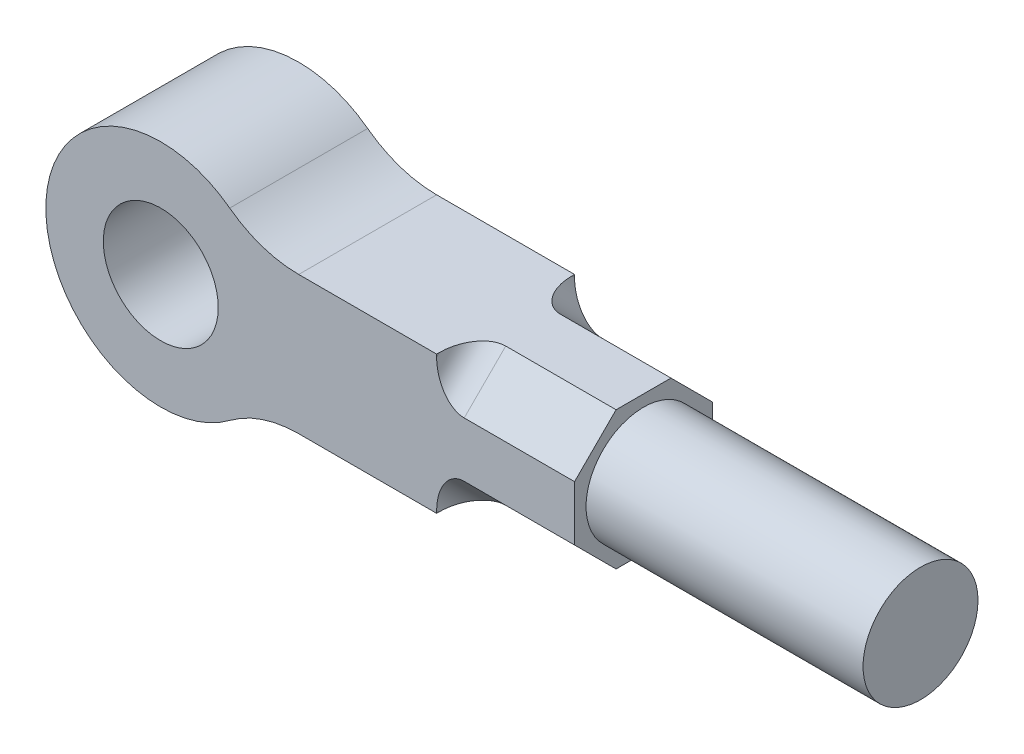
ISO-10303-21;
HEADER;
FILE_DESCRIPTION(('STEP AP214'),'2;1');
FILE_NAME('part.step','',(''),(''),'','','');
FILE_SCHEMA(('AUTOMOTIVE_DESIGN { 1 0 10303 214 1 1 1 1 }'));
ENDSEC;
DATA;
#1=APPLICATION_CONTEXT('core data for automotive mechanical design processes');
#2=APPLICATION_PROTOCOL_DEFINITION('international standard','automotive_design',2000,#1);
#3=PRODUCT_CONTEXT('',#1,'mechanical');
#4=PRODUCT('Part','Part','',(#3));
#5=PRODUCT_RELATED_PRODUCT_CATEGORY('part','',(#4));
#6=PRODUCT_DEFINITION_FORMATION('','',#4);
#7=PRODUCT_DEFINITION_CONTEXT('part definition',#1,'design');
#8=PRODUCT_DEFINITION('design','',#6,#7);
#9=PRODUCT_DEFINITION_SHAPE('','',#8);
#10=(LENGTH_UNIT() NAMED_UNIT(*) SI_UNIT(.MILLI.,.METRE.));
#11=(NAMED_UNIT(*) PLANE_ANGLE_UNIT() SI_UNIT($,.RADIAN.));
#12=(NAMED_UNIT(*) SI_UNIT($,.STERADIAN.) SOLID_ANGLE_UNIT());
#13=UNCERTAINTY_MEASURE_WITH_UNIT(LENGTH_MEASURE(1.E-05),#10,'distance_accuracy_value','');
#14=(GEOMETRIC_REPRESENTATION_CONTEXT(3) GLOBAL_UNCERTAINTY_ASSIGNED_CONTEXT((#13)) GLOBAL_UNIT_ASSIGNED_CONTEXT((#10,
#11,#12)) REPRESENTATION_CONTEXT('',''));
#15=CARTESIAN_POINT('',(0.,0.,0.));
#16=DIRECTION('',(0.,0.,1.));
#17=DIRECTION('',(1.,0.,0.));
#18=AXIS2_PLACEMENT_3D('',#15,#16,#17);
#19=CARTESIAN_POINT('',(60.,-80.,60.));
#20=DIRECTION('',(0.,0.,-1.));
#21=DIRECTION('',(-1.,0.,0.));
#22=AXIS2_PLACEMENT_3D('',#19,#20,#21);
#23=PLANE('',#22);
#24=DIRECTION('',(0.,-1.,0.));
#25=VECTOR('',#24,1.);
#26=CARTESIAN_POINT('',(120.,-11.9400000000001,59.9999999999992));
#27=LINE('',#26,#25);
#28=CARTESIAN_POINT('',(120.,-28.9105627484773,59.9999999999994));
#29=VERTEX_POINT('',#28);
#30=CARTESIAN_POINT('',(120.,-30.0000000000001,59.9999999999994));
#31=VERTEX_POINT('',#30);
#32=EDGE_CURVE('E241',#29,#31,#27,.T.);
#33=ORIENTED_EDGE('',*,*,#32,.F.);
#34=CARTESIAN_POINT('',(132.,-28.9105627484766,60.));
#35=DIRECTION('',(0.,0.,-1.));
#36=DIRECTION('',(0.,-1.,0.));
#37=AXIS2_PLACEMENT_3D('',#34,#35,#36);
#38=ELLIPSE('',#37,16.9705627484773,12.);
#39=CARTESIAN_POINT('',(132.,-11.9400000000001,59.9999999999992));
#40=VERTEX_POINT('',#39);
#41=EDGE_CURVE('E226',#29,#40,#38,.T.);
#42=ORIENTED_EDGE('',*,*,#41,.T.);
#43=DIRECTION('',(1.,0.,0.));
#44=VECTOR('',#43,1.);
#45=CARTESIAN_POINT('',(120.,-11.9400000000001,59.9999999999992));
#46=LINE('',#45,#44);
#47=CARTESIAN_POINT('',(180.,-11.9400000000001,59.9999999999992));
#48=VERTEX_POINT('',#47);
#49=EDGE_CURVE('E248',#40,#48,#46,.T.);
#50=ORIENTED_EDGE('',*,*,#49,.T.);
#51=DIRECTION('',(0.,1.,0.));
#52=VECTOR('',#51,1.);
#53=CARTESIAN_POINT('',(180.,30.,60.));
#54=LINE('',#53,#52);
#55=CARTESIAN_POINT('',(180.,11.9399999999994,60.));
#56=VERTEX_POINT('',#55);
#57=EDGE_CURVE('E285',#48,#56,#54,.T.);
#58=ORIENTED_EDGE('',*,*,#57,.T.);
#59=DIRECTION('',(1.,0.,0.));
#60=VECTOR('',#59,1.);
#61=CARTESIAN_POINT('',(120.,11.9399999999994,60.));
#62=LINE('',#61,#60);
#63=CARTESIAN_POINT('',(132.,11.9399999999994,60.));
#64=VERTEX_POINT('',#63);
#65=EDGE_CURVE('E266',#64,#56,#62,.T.);
#66=ORIENTED_EDGE('',*,*,#65,.F.);
#67=CARTESIAN_POINT('',(132.,28.9105627484763,60.));
#68=DIRECTION('',(0.,0.,-1.));
#69=DIRECTION('',(0.,1.,0.));
#70=AXIS2_PLACEMENT_3D('',#67,#68,#69);
#71=ELLIPSE('',#70,16.970562748477,12.);
#72=CARTESIAN_POINT('',(120.,28.9105627484763,60.));
#73=VERTEX_POINT('',#72);
#74=EDGE_CURVE('E11',#64,#73,#71,.T.);
#75=ORIENTED_EDGE('',*,*,#74,.T.);
#76=DIRECTION('',(0.,-1.,0.));
#77=VECTOR('',#76,1.);
#78=CARTESIAN_POINT('',(120.,0.,60.));
#79=LINE('',#78,#77);
#80=CARTESIAN_POINT('',(120.,30.,60.));
#81=VERTEX_POINT('',#80);
#82=EDGE_CURVE('E261',#81,#73,#79,.T.);
#83=ORIENTED_EDGE('',*,*,#82,.F.);
#84=DIRECTION('',(-1.,0.,0.));
#85=VECTOR('',#84,1.);
#86=CARTESIAN_POINT('',(60.,30.,60.));
#87=LINE('',#86,#85);
#88=CARTESIAN_POINT('',(60.,30.,60.));
#89=VERTEX_POINT('',#88);
#90=EDGE_CURVE('E287',#81,#89,#87,.T.);
#91=ORIENTED_EDGE('',*,*,#90,.T.);
#92=CARTESIAN_POINT('',(60.,80.,60.));
#93=DIRECTION('',(0.,0.,-1.));
#94=DIRECTION('',(-1.,0.,0.));
#95=AXIS2_PLACEMENT_3D('',#92,#93,#94);
#96=CIRCLE('',#95,50.);
#97=CARTESIAN_POINT('',(30.,40.,60.));
#98=VERTEX_POINT('',#97);
#99=EDGE_CURVE('E289',#89,#98,#96,.T.);
#100=ORIENTED_EDGE('',*,*,#99,.T.);
#101=CARTESIAN_POINT('',(0.,0.,60.));
#102=DIRECTION('',(0.,0.,1.));
#103=DIRECTION('',(1.,0.,0.));
#104=AXIS2_PLACEMENT_3D('',#101,#102,#103);
#105=CIRCLE('',#104,50.);
#106=CARTESIAN_POINT('',(30.,-40.,60.));
#107=VERTEX_POINT('',#106);
#108=EDGE_CURVE('E291',#98,#107,#105,.T.);
#109=ORIENTED_EDGE('',*,*,#108,.T.);
#110=CARTESIAN_POINT('',(60.,-80.,60.));
#111=DIRECTION('',(0.,0.,-1.));
#112=DIRECTION('',(-1.,0.,0.));
#113=AXIS2_PLACEMENT_3D('',#110,#111,#112);
#114=CIRCLE('',#113,50.);
#115=CARTESIAN_POINT('',(60.,-30.,60.));
#116=VERTEX_POINT('',#115);
#117=EDGE_CURVE('E279',#107,#116,#114,.T.);
#118=ORIENTED_EDGE('',*,*,#117,.T.);
#119=DIRECTION('',(1.,0.,0.));
#120=VECTOR('',#119,1.);
#121=CARTESIAN_POINT('',(60.,-30.,60.));
#122=LINE('',#121,#120);
#123=EDGE_CURVE('E282',#116,#31,#122,.T.);
#124=ORIENTED_EDGE('',*,*,#123,.T.);
#125=EDGE_LOOP('',(#33,#42,#50,#58,#66,#75,#83,#91,#100,#109,#118,#124));
#126=FACE_BOUND('',#125,.T.);
#127=CARTESIAN_POINT('',(0.,0.,60.));
#128=DIRECTION('',(0.,0.,1.));
#129=DIRECTION('',(1.,0.,0.));
#130=AXIS2_PLACEMENT_3D('',#127,#128,#129);
#131=CIRCLE('',#130,25.);
#132=CARTESIAN_POINT('',(25.,0.,60.));
#133=VERTEX_POINT('',#132);
#134=EDGE_CURVE('E273',#133,#133,#131,.T.);
#135=ORIENTED_EDGE('',*,*,#134,.F.);
#136=EDGE_LOOP('',(#135));
#137=FACE_BOUND('',#136,.T.);
#138=ADVANCED_FACE('F38',(#126,#137),#23,.F.);
#139=CARTESIAN_POINT('',(60.,-80.,0.));
#140=DIRECTION('',(0.,0.,-1.));
#141=DIRECTION('',(-1.,0.,0.));
#142=AXIS2_PLACEMENT_3D('',#139,#140,#141);
#143=PLANE('',#142);
#144=DIRECTION('',(0.,1.,0.));
#145=VECTOR('',#144,1.);
#146=CARTESIAN_POINT('',(120.,11.94,0.));
#147=LINE('',#146,#145);
#148=CARTESIAN_POINT('',(120.,28.9105627484771,0.));
#149=VERTEX_POINT('',#148);
#150=CARTESIAN_POINT('',(120.,30.,0.));
#151=VERTEX_POINT('',#150);
#152=EDGE_CURVE('E359',#149,#151,#147,.T.);
#153=ORIENTED_EDGE('',*,*,#152,.F.);
#154=CARTESIAN_POINT('',(132.,28.9105627484771,0.));
#155=DIRECTION('',(0.,0.,-1.));
#156=DIRECTION('',(0.,-1.,0.));
#157=AXIS2_PLACEMENT_3D('',#154,#155,#156);
#158=ELLIPSE('',#157,16.9705627484771,12.);
#159=CARTESIAN_POINT('',(132.,11.94,0.));
#160=VERTEX_POINT('',#159);
#161=EDGE_CURVE('E222',#149,#160,#158,.F.);
#162=ORIENTED_EDGE('',*,*,#161,.T.);
#163=DIRECTION('',(1.,0.,0.));
#164=VECTOR('',#163,1.);
#165=CARTESIAN_POINT('',(120.,11.94,0.));
#166=LINE('',#165,#164);
#167=CARTESIAN_POINT('',(180.,11.94,0.));
#168=VERTEX_POINT('',#167);
#169=EDGE_CURVE('E259',#160,#168,#166,.T.);
#170=ORIENTED_EDGE('',*,*,#169,.T.);
#171=DIRECTION('',(0.,1.,0.));
#172=VECTOR('',#171,1.);
#173=CARTESIAN_POINT('',(180.,30.,0.));
#174=LINE('',#173,#172);
#175=CARTESIAN_POINT('',(180.,-11.9400000000004,0.));
#176=VERTEX_POINT('',#175);
#177=EDGE_CURVE('E299',#176,#168,#174,.T.);
#178=ORIENTED_EDGE('',*,*,#177,.F.);
#179=DIRECTION('',(1.,0.,0.));
#180=VECTOR('',#179,1.);
#181=CARTESIAN_POINT('',(120.,-11.9400000000004,0.));
#182=LINE('',#181,#180);
#183=CARTESIAN_POINT('',(132.,-11.9400000000004,0.));
#184=VERTEX_POINT('',#183);
#185=EDGE_CURVE('E171',#184,#176,#182,.T.);
#186=ORIENTED_EDGE('',*,*,#185,.F.);
#187=CARTESIAN_POINT('',(132.,-28.9105627484775,0.));
#188=DIRECTION('',(0.,0.,-1.));
#189=DIRECTION('',(0.,-1.,0.));
#190=AXIS2_PLACEMENT_3D('',#187,#188,#189);
#191=ELLIPSE('',#190,16.9705627484771,12.);
#192=CARTESIAN_POINT('',(120.,-28.9105627484775,0.));
#193=VERTEX_POINT('',#192);
#194=EDGE_CURVE('E220',#184,#193,#191,.F.);
#195=ORIENTED_EDGE('',*,*,#194,.T.);
#196=DIRECTION('',(0.,1.,0.));
#197=VECTOR('',#196,1.);
#198=CARTESIAN_POINT('',(120.,0.,0.));
#199=LINE('',#198,#197);
#200=CARTESIAN_POINT('',(120.,-30.,0.));
#201=VERTEX_POINT('',#200);
#202=EDGE_CURVE('E182',#201,#193,#199,.T.);
#203=ORIENTED_EDGE('',*,*,#202,.F.);
#204=DIRECTION('',(1.,0.,0.));
#205=VECTOR('',#204,1.);
#206=CARTESIAN_POINT('',(60.,-30.,0.));
#207=LINE('',#206,#205);
#208=CARTESIAN_POINT('',(60.,-30.,0.));
#209=VERTEX_POINT('',#208);
#210=EDGE_CURVE('E296',#209,#201,#207,.T.);
#211=ORIENTED_EDGE('',*,*,#210,.F.);
#212=CARTESIAN_POINT('',(60.,-80.,0.));
#213=DIRECTION('',(0.,0.,-1.));
#214=DIRECTION('',(-1.,0.,0.));
#215=AXIS2_PLACEMENT_3D('',#212,#213,#214);
#216=CIRCLE('',#215,50.);
#217=CARTESIAN_POINT('',(30.,-40.,0.));
#218=VERTEX_POINT('',#217);
#219=EDGE_CURVE('E276',#218,#209,#216,.T.);
#220=ORIENTED_EDGE('',*,*,#219,.F.);
#221=CARTESIAN_POINT('',(0.,0.,0.));
#222=DIRECTION('',(0.,0.,1.));
#223=DIRECTION('',(1.,0.,0.));
#224=AXIS2_PLACEMENT_3D('',#221,#222,#223);
#225=CIRCLE('',#224,50.);
#226=CARTESIAN_POINT('',(30.,40.,0.));
#227=VERTEX_POINT('',#226);
#228=EDGE_CURVE('E283',#227,#218,#225,.T.);
#229=ORIENTED_EDGE('',*,*,#228,.F.);
#230=CARTESIAN_POINT('',(60.,80.,0.));
#231=DIRECTION('',(0.,0.,-1.));
#232=DIRECTION('',(-1.,0.,0.));
#233=AXIS2_PLACEMENT_3D('',#230,#231,#232);
#234=CIRCLE('',#233,50.);
#235=CARTESIAN_POINT('',(60.,30.,0.));
#236=VERTEX_POINT('',#235);
#237=EDGE_CURVE('E303',#236,#227,#234,.T.);
#238=ORIENTED_EDGE('',*,*,#237,.F.);
#239=DIRECTION('',(-1.,0.,0.));
#240=VECTOR('',#239,1.);
#241=CARTESIAN_POINT('',(60.,30.,0.));
#242=LINE('',#241,#240);
#243=EDGE_CURVE('E301',#151,#236,#242,.T.);
#244=ORIENTED_EDGE('',*,*,#243,.F.);
#245=EDGE_LOOP('',(#153,#162,#170,#178,#186,#195,#203,#211,#220,#229,#238,#244));
#246=FACE_BOUND('',#245,.T.);
#247=CARTESIAN_POINT('',(0.,0.,0.));
#248=DIRECTION('',(0.,0.,1.));
#249=DIRECTION('',(1.,0.,0.));
#250=AXIS2_PLACEMENT_3D('',#247,#248,#249);
#251=CIRCLE('',#250,25.);
#252=CARTESIAN_POINT('',(25.,0.,0.));
#253=VERTEX_POINT('',#252);
#254=EDGE_CURVE('E271',#253,#253,#251,.T.);
#255=ORIENTED_EDGE('',*,*,#254,.T.);
#256=EDGE_LOOP('',(#255));
#257=FACE_BOUND('',#256,.T.);
#258=ADVANCED_FACE('F322',(#246,#257),#143,.T.);
#259=CARTESIAN_POINT('',(60.,-80.,60.));
#260=DIRECTION('',(0.,0.,-1.));
#261=DIRECTION('',(-1.,0.,0.));
#262=AXIS2_PLACEMENT_3D('',#259,#260,#261);
#263=CYLINDRICAL_SURFACE('',#262,50.);
#264=ORIENTED_EDGE('',*,*,#219,.T.);
#265=DIRECTION('',(0.,0.,-1.));
#266=VECTOR('',#265,1.);
#267=CARTESIAN_POINT('',(60.,-30.,60.));
#268=LINE('',#267,#266);
#269=EDGE_CURVE('E189',#116,#209,#268,.T.);
#270=ORIENTED_EDGE('',*,*,#269,.F.);
#271=ORIENTED_EDGE('',*,*,#117,.F.);
#272=DIRECTION('',(0.,0.,-1.));
#273=VECTOR('',#272,1.);
#274=CARTESIAN_POINT('',(30.,-40.,60.));
#275=LINE('',#274,#273);
#276=EDGE_CURVE('E293',#107,#218,#275,.T.);
#277=ORIENTED_EDGE('',*,*,#276,.T.);
#278=EDGE_LOOP('',(#264,#270,#271,#277));
#279=FACE_BOUND('',#278,.T.);
#280=ADVANCED_FACE('F331',(#279),#263,.F.);
#281=CARTESIAN_POINT('',(60.,-30.,60.));
#282=DIRECTION('',(0.,1.,0.));
#283=DIRECTION('',(0.,0.,1.));
#284=AXIS2_PLACEMENT_3D('',#281,#282,#283);
#285=PLANE('',#284);
#286=DIRECTION('',(0.,0.,-1.));
#287=VECTOR('',#286,1.);
#288=CARTESIAN_POINT('',(180.,-30.,60.));
#289=LINE('',#288,#287);
#290=CARTESIAN_POINT('',(180.,-30.,41.9399999999996));
#291=VERTEX_POINT('',#290);
#292=CARTESIAN_POINT('',(180.,-30.,18.0599999999997));
#293=VERTEX_POINT('',#292);
#294=EDGE_CURVE('E166',#291,#293,#289,.T.);
#295=ORIENTED_EDGE('',*,*,#294,.F.);
#296=DIRECTION('',(1.,0.,0.));
#297=VECTOR('',#296,1.);
#298=CARTESIAN_POINT('',(120.,-30.0000000000003,41.9399999999994));
#299=LINE('',#298,#297);
#300=CARTESIAN_POINT('',(132.,-30.0000000000003,41.9399999999994));
#301=VERTEX_POINT('',#300);
#302=EDGE_CURVE('E234',#301,#291,#299,.T.);
#303=ORIENTED_EDGE('',*,*,#302,.F.);
#304=CARTESIAN_POINT('',(132.,-30.,58.9105627484766));
#305=DIRECTION('',(0.,1.,0.));
#306=DIRECTION('',(0.,0.,-1.));
#307=AXIS2_PLACEMENT_3D('',#304,#305,#306);
#308=ELLIPSE('',#307,16.970562748477,12.);
#309=CARTESIAN_POINT('',(120.,-30.0000000000001,58.9105627484765));
#310=VERTEX_POINT('',#309);
#311=EDGE_CURVE('E228',#301,#310,#308,.T.);
#312=ORIENTED_EDGE('',*,*,#311,.T.);
#313=DIRECTION('',(0.,0.,-1.));
#314=VECTOR('',#313,1.);
#315=CARTESIAN_POINT('',(120.,-30.0000000000001,59.9999999999994));
#316=LINE('',#315,#314);
#317=EDGE_CURVE('E232',#31,#310,#316,.T.);
#318=ORIENTED_EDGE('',*,*,#317,.F.);
#319=ORIENTED_EDGE('',*,*,#123,.F.);
#320=ORIENTED_EDGE('',*,*,#269,.T.);
#321=ORIENTED_EDGE('',*,*,#210,.T.);
#322=DIRECTION('',(0.,0.,-1.));
#323=VECTOR('',#322,1.);
#324=CARTESIAN_POINT('',(120.,-30.,0.));
#325=LINE('',#324,#323);
#326=CARTESIAN_POINT('',(120.,-30.,1.08943725152253));
#327=VERTEX_POINT('',#326);
#328=EDGE_CURVE('E367',#327,#201,#325,.T.);
#329=ORIENTED_EDGE('',*,*,#328,.F.);
#330=CARTESIAN_POINT('',(132.,-30.,1.08943725152253));
#331=DIRECTION('',(0.,1.,0.));
#332=DIRECTION('',(0.,0.,1.));
#333=AXIS2_PLACEMENT_3D('',#330,#331,#332);
#334=ELLIPSE('',#333,16.9705627484772,12.);
#335=CARTESIAN_POINT('',(132.,-30.,18.0599999999997));
#336=VERTEX_POINT('',#335);
#337=EDGE_CURVE('E168',#327,#336,#334,.T.);
#338=ORIENTED_EDGE('',*,*,#337,.T.);
#339=DIRECTION('',(1.,0.,0.));
#340=VECTOR('',#339,1.);
#341=CARTESIAN_POINT('',(120.,-30.,18.0599999999997));
#342=LINE('',#341,#340);
#343=EDGE_CURVE('E161',#336,#293,#342,.T.);
#344=ORIENTED_EDGE('',*,*,#343,.T.);
#345=EDGE_LOOP('',(#295,#303,#312,#318,#319,#320,#321,#329,#338,#344));
#346=FACE_BOUND('',#345,.T.);
#347=ADVANCED_FACE('F163',(#346),#285,.F.);
#348=CARTESIAN_POINT('',(180.,30.,60.));
#349=DIRECTION('',(-1.,0.,0.));
#350=DIRECTION('',(0.,0.,1.));
#351=AXIS2_PLACEMENT_3D('',#348,#349,#350);
#352=PLANE('',#351);
#353=CARTESIAN_POINT('',(180.,0.,30.));
#354=DIRECTION('',(1.,0.,0.));
#355=DIRECTION('',(0.,0.,-1.));
#356=AXIS2_PLACEMENT_3D('',#353,#354,#355);
#357=CIRCLE('',#356,25.);
#358=CARTESIAN_POINT('',(180.,0.,5.));
#359=VERTEX_POINT('',#358);
#360=EDGE_CURVE('E193',#359,#359,#357,.T.);
#361=ORIENTED_EDGE('',*,*,#360,.F.);
#362=EDGE_LOOP('',(#361));
#363=FACE_BOUND('',#362,.T.);
#364=ORIENTED_EDGE('',*,*,#57,.F.);
#365=DIRECTION('',(0.,0.707106781186552,0.707106781186543));
#366=VECTOR('',#365,1.);
#367=CARTESIAN_POINT('',(180.,-30.0000000000003,41.9399999999994));
#368=LINE('',#367,#366);
#369=EDGE_CURVE('E188',#291,#48,#368,.T.);
#370=ORIENTED_EDGE('',*,*,#369,.F.);
#371=ORIENTED_EDGE('',*,*,#294,.T.);
#372=DIRECTION('',(0.,-0.707106781186545,0.70710678118655));
#373=VECTOR('',#372,1.);
#374=CARTESIAN_POINT('',(180.,-5.97000000000024,-5.9700000000002));
#375=LINE('',#374,#373);
#376=EDGE_CURVE('E175',#176,#293,#375,.T.);
#377=ORIENTED_EDGE('',*,*,#376,.F.);
#378=ORIENTED_EDGE('',*,*,#177,.T.);
#379=DIRECTION('',(0.,-0.707106781186547,-0.707106781186547));
#380=VECTOR('',#379,1.);
#381=CARTESIAN_POINT('',(180.,30.,18.06));
#382=LINE('',#381,#380);
#383=CARTESIAN_POINT('',(180.,30.,18.06));
#384=VERTEX_POINT('',#383);
#385=EDGE_CURVE('E172',#384,#168,#382,.T.);
#386=ORIENTED_EDGE('',*,*,#385,.F.);
#387=DIRECTION('',(0.,0.,-1.));
#388=VECTOR('',#387,1.);
#389=CARTESIAN_POINT('',(180.,30.,60.));
#390=LINE('',#389,#388);
#391=CARTESIAN_POINT('',(180.,30.,41.939999999999));
#392=VERTEX_POINT('',#391);
#393=EDGE_CURVE('E190',#392,#384,#390,.T.);
#394=ORIENTED_EDGE('',*,*,#393,.F.);
#395=DIRECTION('',(0.,0.70710678118654,-0.707106781186555));
#396=VECTOR('',#395,1.);
#397=CARTESIAN_POINT('',(180.,35.9699999999998,35.969999999999));
#398=LINE('',#397,#396);
#399=EDGE_CURVE('E181',#56,#392,#398,.T.);
#400=ORIENTED_EDGE('',*,*,#399,.F.);
#401=EDGE_LOOP('',(#364,#370,#371,#377,#378,#386,#394,#400));
#402=FACE_BOUND('',#401,.T.);
#403=ADVANCED_FACE('F186',(#363,#402),#352,.F.);
#404=CARTESIAN_POINT('',(60.,30.,60.));
#405=DIRECTION('',(0.,-1.,0.));
#406=DIRECTION('',(1.,0.,0.));
#407=AXIS2_PLACEMENT_3D('',#404,#405,#406);
#408=PLANE('',#407);
#409=ORIENTED_EDGE('',*,*,#393,.T.);
#410=DIRECTION('',(1.,0.,0.));
#411=VECTOR('',#410,1.);
#412=CARTESIAN_POINT('',(120.,30.,18.06));
#413=LINE('',#412,#411);
#414=CARTESIAN_POINT('',(132.,30.,18.06));
#415=VERTEX_POINT('',#414);
#416=EDGE_CURVE('E346',#415,#384,#413,.T.);
#417=ORIENTED_EDGE('',*,*,#416,.F.);
#418=CARTESIAN_POINT('',(132.,30.,1.08943725152286));
#419=DIRECTION('',(0.,-1.,0.));
#420=DIRECTION('',(0.,0.,-1.));
#421=AXIS2_PLACEMENT_3D('',#418,#419,#420);
#422=ELLIPSE('',#421,16.9705627484771,12.);
#423=CARTESIAN_POINT('',(120.,30.,1.08943725152286));
#424=VERTEX_POINT('',#423);
#425=EDGE_CURVE('E224',#415,#424,#422,.T.);
#426=ORIENTED_EDGE('',*,*,#425,.T.);
#427=DIRECTION('',(0.,0.,1.));
#428=VECTOR('',#427,1.);
#429=CARTESIAN_POINT('',(120.,30.,0.));
#430=LINE('',#429,#428);
#431=EDGE_CURVE('E351',#151,#424,#430,.T.);
#432=ORIENTED_EDGE('',*,*,#431,.F.);
#433=ORIENTED_EDGE('',*,*,#243,.T.);
#434=DIRECTION('',(0.,0.,-1.));
#435=VECTOR('',#434,1.);
#436=CARTESIAN_POINT('',(60.,30.,60.));
#437=LINE('',#436,#435);
#438=EDGE_CURVE('E196',#89,#236,#437,.T.);
#439=ORIENTED_EDGE('',*,*,#438,.F.);
#440=ORIENTED_EDGE('',*,*,#90,.F.);
#441=DIRECTION('',(0.,0.,1.));
#442=VECTOR('',#441,1.);
#443=CARTESIAN_POINT('',(120.,30.,0.));
#444=LINE('',#443,#442);
#445=CARTESIAN_POINT('',(120.,30.,58.9105627484763));
#446=VERTEX_POINT('',#445);
#447=EDGE_CURVE('E264',#446,#81,#444,.T.);
#448=ORIENTED_EDGE('',*,*,#447,.F.);
#449=CARTESIAN_POINT('',(132.,30.,58.9105627484763));
#450=DIRECTION('',(0.,-1.,0.));
#451=DIRECTION('',(0.,0.,-1.));
#452=AXIS2_PLACEMENT_3D('',#449,#450,#451);
#453=ELLIPSE('',#452,16.9705627484773,12.);
#454=CARTESIAN_POINT('',(132.,30.,41.939999999999));
#455=VERTEX_POINT('',#454);
#456=EDGE_CURVE('E46',#446,#455,#453,.T.);
#457=ORIENTED_EDGE('',*,*,#456,.T.);
#458=DIRECTION('',(1.,0.,0.));
#459=VECTOR('',#458,1.);
#460=CARTESIAN_POINT('',(120.,30.,41.939999999999));
#461=LINE('',#460,#459);
#462=EDGE_CURVE('E269',#455,#392,#461,.T.);
#463=ORIENTED_EDGE('',*,*,#462,.T.);
#464=EDGE_LOOP('',(#409,#417,#426,#432,#433,#439,#440,#448,#457,#463));
#465=FACE_BOUND('',#464,.T.);
#466=ADVANCED_FACE('F334',(#465),#408,.F.);
#467=CARTESIAN_POINT('',(60.,80.,60.));
#468=DIRECTION('',(0.,0.,-1.));
#469=DIRECTION('',(-1.,0.,0.));
#470=AXIS2_PLACEMENT_3D('',#467,#468,#469);
#471=CYLINDRICAL_SURFACE('',#470,50.);
#472=ORIENTED_EDGE('',*,*,#237,.T.);
#473=DIRECTION('',(0.,0.,-1.));
#474=VECTOR('',#473,1.);
#475=CARTESIAN_POINT('',(30.,40.,60.));
#476=LINE('',#475,#474);
#477=EDGE_CURVE('E308',#98,#227,#476,.T.);
#478=ORIENTED_EDGE('',*,*,#477,.F.);
#479=ORIENTED_EDGE('',*,*,#99,.F.);
#480=ORIENTED_EDGE('',*,*,#438,.T.);
#481=EDGE_LOOP('',(#472,#478,#479,#480));
#482=FACE_BOUND('',#481,.T.);
#483=ADVANCED_FACE('F315',(#482),#471,.F.);
#484=CARTESIAN_POINT('',(0.,0.,60.));
#485=DIRECTION('',(0.,0.,-1.));
#486=DIRECTION('',(-1.,0.,0.));
#487=AXIS2_PLACEMENT_3D('',#484,#485,#486);
#488=CYLINDRICAL_SURFACE('',#487,50.);
#489=ORIENTED_EDGE('',*,*,#228,.T.);
#490=ORIENTED_EDGE('',*,*,#276,.F.);
#491=ORIENTED_EDGE('',*,*,#108,.F.);
#492=ORIENTED_EDGE('',*,*,#477,.T.);
#493=EDGE_LOOP('',(#489,#490,#491,#492));
#494=FACE_BOUND('',#493,.T.);
#495=ADVANCED_FACE('F327',(#494),#488,.T.);
#496=CARTESIAN_POINT('',(0.,0.,60.));
#497=DIRECTION('',(0.,0.,-1.));
#498=DIRECTION('',(-1.,0.,0.));
#499=AXIS2_PLACEMENT_3D('',#496,#497,#498);
#500=CYLINDRICAL_SURFACE('',#499,25.);
#501=ORIENTED_EDGE('',*,*,#134,.T.);
#502=EDGE_LOOP('',(#501));
#503=FACE_BOUND('',#502,.T.);
#504=ORIENTED_EDGE('',*,*,#254,.F.);
#505=EDGE_LOOP('',(#504));
#506=FACE_BOUND('',#505,.T.);
#507=ADVANCED_FACE('F390',(#503,#506),#500,.F.);
#508=CARTESIAN_POINT('',(120.,35.9699999999998,35.969999999999));
#509=DIRECTION('',(0.,-0.707106781186555,-0.70710678118654));
#510=DIRECTION('',(0.,0.70710678118654,-0.707106781186555));
#511=AXIS2_PLACEMENT_3D('',#508,#509,#510);
#512=PLANE('',#511);
#513=ORIENTED_EDGE('',*,*,#462,.F.);
#514=DIRECTION('',(0.,0.70710678118654,-0.707106781186555));
#515=VECTOR('',#514,1.);
#516=CARTESIAN_POINT('',(132.,35.9699999999998,35.969999999999));
#517=LINE('',#516,#515);
#518=EDGE_CURVE('E53',#455,#64,#517,.F.);
#519=ORIENTED_EDGE('',*,*,#518,.T.);
#520=ORIENTED_EDGE('',*,*,#65,.T.);
#521=ORIENTED_EDGE('',*,*,#399,.T.);
#522=EDGE_LOOP('',(#513,#519,#520,#521));
#523=FACE_BOUND('',#522,.T.);
#524=ADVANCED_FACE('F341',(#523),#512,.F.);
#525=CARTESIAN_POINT('',(120.,0.,0.));
#526=DIRECTION('',(1.,0.,0.));
#527=DIRECTION('',(0.,0.,-1.));
#528=AXIS2_PLACEMENT_3D('',#525,#526,#527);
#529=PLANE('',#528);
#530=ORIENTED_EDGE('',*,*,#82,.T.);
#531=DIRECTION('',(0.,0.70710678118654,-0.707106781186555));
#532=VECTOR('',#531,1.);
#533=CARTESIAN_POINT('',(120.,44.4552813742385,44.4552813742375));
#534=LINE('',#533,#532);
#535=EDGE_CURVE('E215',#73,#446,#534,.T.);
#536=ORIENTED_EDGE('',*,*,#535,.T.);
#537=ORIENTED_EDGE('',*,*,#447,.T.);
#538=EDGE_LOOP('',(#530,#536,#537));
#539=FACE_BOUND('',#538,.T.);
#540=ADVANCED_FACE('F336',(#539),#529,.T.);
#541=CARTESIAN_POINT('',(120.,30.,18.06));
#542=DIRECTION('',(0.,-0.707106781186547,0.707106781186547));
#543=DIRECTION('',(0.,-0.707106781186548,-0.707106781186548));
#544=AXIS2_PLACEMENT_3D('',#541,#542,#543);
#545=PLANE('',#544);
#546=ORIENTED_EDGE('',*,*,#169,.F.);
#547=DIRECTION('',(0.,-0.707106781186548,-0.707106781186548));
#548=VECTOR('',#547,1.);
#549=CARTESIAN_POINT('',(132.,30.,18.06));
#550=LINE('',#549,#548);
#551=EDGE_CURVE('E208',#160,#415,#550,.F.);
#552=ORIENTED_EDGE('',*,*,#551,.T.);
#553=ORIENTED_EDGE('',*,*,#416,.T.);
#554=ORIENTED_EDGE('',*,*,#385,.T.);
#555=EDGE_LOOP('',(#546,#552,#553,#554));
#556=FACE_BOUND('',#555,.T.);
#557=ADVANCED_FACE('F422',(#556),#545,.F.);
#558=CARTESIAN_POINT('',(120.,0.,0.));
#559=DIRECTION('',(1.,0.,0.));
#560=DIRECTION('',(0.,0.,-1.));
#561=AXIS2_PLACEMENT_3D('',#558,#559,#560);
#562=PLANE('',#561);
#563=ORIENTED_EDGE('',*,*,#431,.T.);
#564=DIRECTION('',(0.,-0.707106781186548,-0.707106781186548));
#565=VECTOR('',#564,1.);
#566=CARTESIAN_POINT('',(120.,14.4552813742386,-14.4552813742386));
#567=LINE('',#566,#565);
#568=EDGE_CURVE('E205',#424,#149,#567,.T.);
#569=ORIENTED_EDGE('',*,*,#568,.T.);
#570=ORIENTED_EDGE('',*,*,#152,.T.);
#571=EDGE_LOOP('',(#563,#569,#570));
#572=FACE_BOUND('',#571,.T.);
#573=ADVANCED_FACE('F358',(#572),#562,.T.);
#574=CARTESIAN_POINT('',(120.,-5.97000000000024,-5.9700000000002));
#575=DIRECTION('',(0.,0.70710678118655,0.707106781186545));
#576=DIRECTION('',(0.,-0.707106781186545,0.70710678118655));
#577=AXIS2_PLACEMENT_3D('',#574,#575,#576);
#578=PLANE('',#577);
#579=ORIENTED_EDGE('',*,*,#343,.F.);
#580=DIRECTION('',(0.,-0.707106781186545,0.70710678118655));
#581=VECTOR('',#580,1.);
#582=CARTESIAN_POINT('',(132.,-5.97000000000024,-5.9700000000002));
#583=LINE('',#582,#581);
#584=EDGE_CURVE('E203',#336,#184,#583,.F.);
#585=ORIENTED_EDGE('',*,*,#584,.T.);
#586=ORIENTED_EDGE('',*,*,#185,.T.);
#587=ORIENTED_EDGE('',*,*,#376,.T.);
#588=EDGE_LOOP('',(#579,#585,#586,#587));
#589=FACE_BOUND('',#588,.T.);
#590=ADVANCED_FACE('F176',(#589),#578,.F.);
#591=CARTESIAN_POINT('',(120.,0.,0.));
#592=DIRECTION('',(1.,0.,0.));
#593=DIRECTION('',(0.,0.,-1.));
#594=AXIS2_PLACEMENT_3D('',#591,#592,#593);
#595=PLANE('',#594);
#596=ORIENTED_EDGE('',*,*,#202,.T.);
#597=DIRECTION('',(0.,-0.707106781186545,0.70710678118655));
#598=VECTOR('',#597,1.);
#599=CARTESIAN_POINT('',(120.,-14.4552813742388,-14.4552813742387));
#600=LINE('',#599,#598);
#601=EDGE_CURVE('E200',#193,#327,#600,.T.);
#602=ORIENTED_EDGE('',*,*,#601,.T.);
#603=ORIENTED_EDGE('',*,*,#328,.T.);
#604=EDGE_LOOP('',(#596,#602,#603));
#605=FACE_BOUND('',#604,.T.);
#606=ADVANCED_FACE('F441',(#605),#595,.T.);
#607=CARTESIAN_POINT('',(120.,-30.0000000000003,41.9399999999994));
#608=DIRECTION('',(0.,0.707106781186543,-0.707106781186552));
#609=DIRECTION('',(0.,0.707106781186552,0.707106781186543));
#610=AXIS2_PLACEMENT_3D('',#607,#608,#609);
#611=PLANE('',#610);
#612=ORIENTED_EDGE('',*,*,#49,.F.);
#613=DIRECTION('',(0.,0.707106781186552,0.707106781186543));
#614=VECTOR('',#613,1.);
#615=CARTESIAN_POINT('',(132.,-30.0000000000003,41.9399999999994));
#616=LINE('',#615,#614);
#617=EDGE_CURVE('E213',#40,#301,#616,.F.);
#618=ORIENTED_EDGE('',*,*,#617,.T.);
#619=ORIENTED_EDGE('',*,*,#302,.T.);
#620=ORIENTED_EDGE('',*,*,#369,.T.);
#621=EDGE_LOOP('',(#612,#618,#619,#620));
#622=FACE_BOUND('',#621,.T.);
#623=ADVANCED_FACE('F250',(#622),#611,.F.);
#624=CARTESIAN_POINT('',(120.,0.,0.));
#625=DIRECTION('',(-1.,0.,0.));
#626=DIRECTION('',(0.,0.,1.));
#627=AXIS2_PLACEMENT_3D('',#624,#625,#626);
#628=PLANE('',#627);
#629=ORIENTED_EDGE('',*,*,#317,.T.);
#630=DIRECTION('',(0.,0.707106781186552,0.707106781186543));
#631=VECTOR('',#630,1.);
#632=CARTESIAN_POINT('',(120.,-20.4252813742386,68.4852813742379));
#633=LINE('',#632,#631);
#634=EDGE_CURVE('E210',#310,#29,#633,.T.);
#635=ORIENTED_EDGE('',*,*,#634,.T.);
#636=ORIENTED_EDGE('',*,*,#32,.T.);
#637=EDGE_LOOP('',(#629,#635,#636));
#638=FACE_BOUND('',#637,.T.);
#639=ADVANCED_FACE('F239',(#638),#628,.F.);
#640=CARTESIAN_POINT('',(300.5,0.,30.));
#641=DIRECTION('',(-1.,0.,0.));
#642=DIRECTION('',(0.,0.,1.));
#643=AXIS2_PLACEMENT_3D('',#640,#641,#642);
#644=CYLINDRICAL_SURFACE('',#643,25.);
#645=CARTESIAN_POINT('',(300.5,0.,30.));
#646=DIRECTION('',(1.,0.,0.));
#647=DIRECTION('',(0.,0.,-1.));
#648=AXIS2_PLACEMENT_3D('',#645,#646,#647);
#649=CIRCLE('',#648,25.);
#650=CARTESIAN_POINT('',(300.5,0.,5.));
#651=VERTEX_POINT('',#650);
#652=EDGE_CURVE('E251',#651,#651,#649,.T.);
#653=ORIENTED_EDGE('',*,*,#652,.F.);
#654=EDGE_LOOP('',(#653));
#655=FACE_BOUND('',#654,.T.);
#656=ORIENTED_EDGE('',*,*,#360,.T.);
#657=EDGE_LOOP('',(#656));
#658=FACE_BOUND('',#657,.T.);
#659=ADVANCED_FACE('F373',(#655,#658),#644,.T.);
#660=CARTESIAN_POINT('',(300.5,0.,0.));
#661=DIRECTION('',(1.,0.,0.));
#662=DIRECTION('',(0.,0.,-1.));
#663=AXIS2_PLACEMENT_3D('',#660,#661,#662);
#664=PLANE('',#663);
#665=ORIENTED_EDGE('',*,*,#652,.T.);
#666=EDGE_LOOP('',(#665));
#667=FACE_BOUND('',#666,.T.);
#668=ADVANCED_FACE('F468',(#667),#664,.T.);
#669=CARTESIAN_POINT('',(132.,-14.4552813742388,-14.4552813742387));
#670=DIRECTION('',(0.,-0.707106781186545,0.70710678118655));
#671=DIRECTION('',(0.,-0.70710678118655,-0.707106781186545));
#672=AXIS2_PLACEMENT_3D('',#669,#670,#671);
#673=CYLINDRICAL_SURFACE('',#672,12.);
#674=ORIENTED_EDGE('',*,*,#194,.F.);
#675=ORIENTED_EDGE('',*,*,#584,.F.);
#676=ORIENTED_EDGE('',*,*,#337,.F.);
#677=ORIENTED_EDGE('',*,*,#601,.F.);
#678=EDGE_LOOP('',(#674,#675,#676,#677));
#679=FACE_BOUND('',#678,.T.);
#680=ADVANCED_FACE('F476',(#679),#673,.F.);
#681=CARTESIAN_POINT('',(132.,14.4552813742386,-14.4552813742386));
#682=DIRECTION('',(0.,-0.707106781186548,-0.707106781186548));
#683=DIRECTION('',(0.,0.707106781186548,-0.707106781186548));
#684=AXIS2_PLACEMENT_3D('',#681,#682,#683);
#685=CYLINDRICAL_SURFACE('',#684,12.);
#686=ORIENTED_EDGE('',*,*,#425,.F.);
#687=ORIENTED_EDGE('',*,*,#551,.F.);
#688=ORIENTED_EDGE('',*,*,#161,.F.);
#689=ORIENTED_EDGE('',*,*,#568,.F.);
#690=EDGE_LOOP('',(#686,#687,#688,#689));
#691=FACE_BOUND('',#690,.T.);
#692=ADVANCED_FACE('F356',(#691),#685,.F.);
#693=CARTESIAN_POINT('',(132.,-44.4552813742381,44.4552813742387));
#694=DIRECTION('',(0.,-0.707106781186552,-0.707106781186543));
#695=DIRECTION('',(0.,0.707106781186543,-0.707106781186552));
#696=AXIS2_PLACEMENT_3D('',#693,#694,#695);
#697=CYLINDRICAL_SURFACE('',#696,12.);
#698=ORIENTED_EDGE('',*,*,#311,.F.);
#699=ORIENTED_EDGE('',*,*,#617,.F.);
#700=ORIENTED_EDGE('',*,*,#41,.F.);
#701=ORIENTED_EDGE('',*,*,#634,.F.);
#702=EDGE_LOOP('',(#698,#699,#700,#701));
#703=FACE_BOUND('',#702,.T.);
#704=ADVANCED_FACE('F243',(#703),#697,.F.);
#705=CARTESIAN_POINT('',(132.,44.4552813742385,44.4552813742375));
#706=DIRECTION('',(0.,0.70710678118654,-0.707106781186555));
#707=DIRECTION('',(0.,0.707106781186555,0.70710678118654));
#708=AXIS2_PLACEMENT_3D('',#705,#706,#707);
#709=CYLINDRICAL_SURFACE('',#708,12.);
#710=ORIENTED_EDGE('',*,*,#74,.F.);
#711=ORIENTED_EDGE('',*,*,#518,.F.);
#712=ORIENTED_EDGE('',*,*,#456,.F.);
#713=ORIENTED_EDGE('',*,*,#535,.F.);
#714=EDGE_LOOP('',(#710,#711,#712,#713));
#715=FACE_BOUND('',#714,.T.);
#716=ADVANCED_FACE('F40',(#715),#709,.F.);
#717=CLOSED_SHELL('',(#138,#258,#280,#347,#403,#466,#483,#495,#507,#524,#540,#557,#573,#590,
#606,#623,#639,#659,#668,#680,#692,#704,#716));
#718=MANIFOLD_SOLID_BREP('B2',#717);
#719=ADVANCED_BREP_SHAPE_REPRESENTATION('',(#18,#718),#14);
#720=SHAPE_DEFINITION_REPRESENTATION(#9,#719);
ENDSEC;
END-ISO-10303-21;
